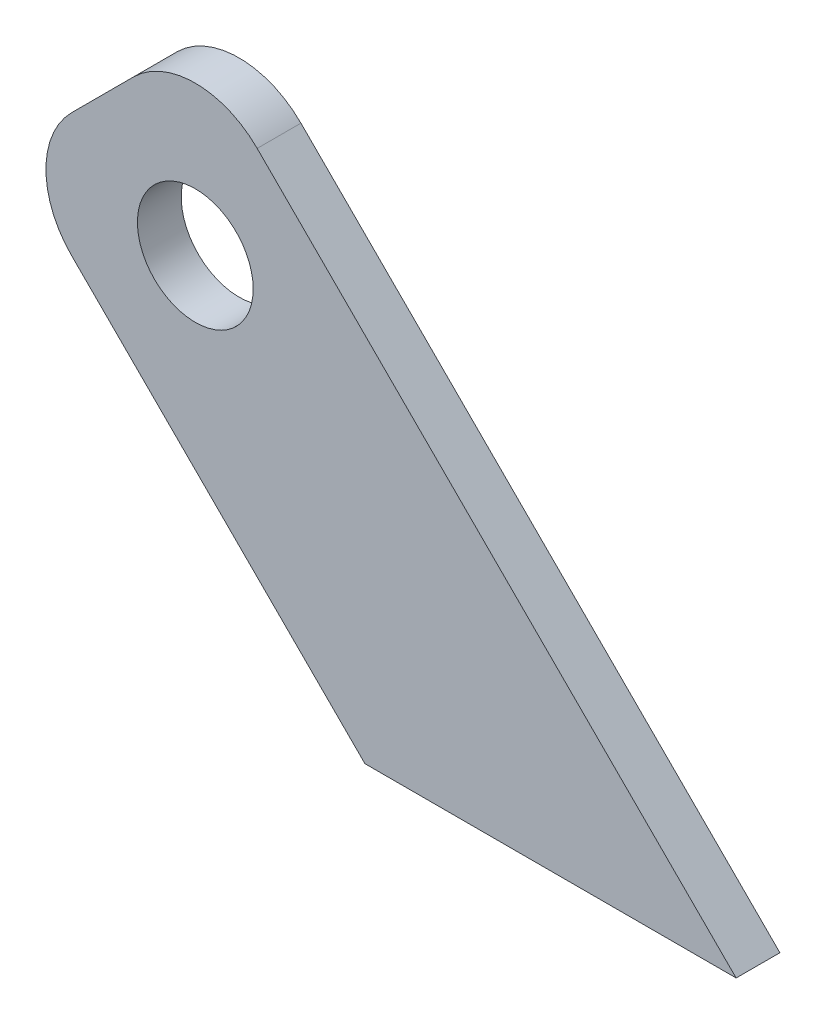
ISO-10303-21;
HEADER;
FILE_DESCRIPTION(('STEP AP214'),'2;1');
FILE_NAME('part.step','',(''),(''),'','','');
FILE_SCHEMA(('AUTOMOTIVE_DESIGN { 1 0 10303 214 1 1 1 1 }'));
ENDSEC;
DATA;
#1=APPLICATION_CONTEXT('core data for automotive mechanical design processes');
#2=APPLICATION_PROTOCOL_DEFINITION('international standard','automotive_design',2000,#1);
#3=PRODUCT_CONTEXT('',#1,'mechanical');
#4=PRODUCT('Part','Part','',(#3));
#5=PRODUCT_RELATED_PRODUCT_CATEGORY('part','',(#4));
#6=PRODUCT_DEFINITION_FORMATION('','',#4);
#7=PRODUCT_DEFINITION_CONTEXT('part definition',#1,'design');
#8=PRODUCT_DEFINITION('design','',#6,#7);
#9=PRODUCT_DEFINITION_SHAPE('','',#8);
#10=(LENGTH_UNIT() NAMED_UNIT(*) SI_UNIT(.MILLI.,.METRE.));
#11=(NAMED_UNIT(*) PLANE_ANGLE_UNIT() SI_UNIT($,.RADIAN.));
#12=(NAMED_UNIT(*) SI_UNIT($,.STERADIAN.) SOLID_ANGLE_UNIT());
#13=UNCERTAINTY_MEASURE_WITH_UNIT(LENGTH_MEASURE(1.E-05),#10,'distance_accuracy_value','');
#14=(GEOMETRIC_REPRESENTATION_CONTEXT(3) GLOBAL_UNCERTAINTY_ASSIGNED_CONTEXT((#13)) GLOBAL_UNIT_ASSIGNED_CONTEXT((#10,
#11,#12)) REPRESENTATION_CONTEXT('',''));
#15=CARTESIAN_POINT('',(0.,0.,0.));
#16=DIRECTION('',(0.,0.,1.));
#17=DIRECTION('',(1.,0.,0.));
#18=AXIS2_PLACEMENT_3D('',#15,#16,#17);
#19=CARTESIAN_POINT('',(33.610044183049,38.0994845362194,3.175));
#20=DIRECTION('',(0.,0.,-1.));
#21=DIRECTION('',(-1.,0.,0.));
#22=AXIS2_PLACEMENT_3D('',#19,#20,#21);
#23=CYLINDRICAL_SURFACE('',#22,6.35);
#24=CARTESIAN_POINT('',(33.610044183049,38.0994845362194,0.));
#25=DIRECTION('',(0.,0.,1.));
#26=DIRECTION('',(1.,0.,0.));
#27=AXIS2_PLACEMENT_3D('',#24,#25,#26);
#28=CIRCLE('',#27,6.35);
#29=CARTESIAN_POINT('',(29.1198730615669,33.6093995370453,0.));
#30=VERTEX_POINT('',#29);
#31=CARTESIAN_POINT('',(29.119959183875,42.5896556577015,0.));
#32=VERTEX_POINT('',#31);
#33=EDGE_CURVE('E144',#30,#32,#28,.F.);
#34=ORIENTED_EDGE('',*,*,#33,.F.);
#35=DIRECTION('',(0.,0.,-1.));
#36=VECTOR('',#35,1.);
#37=CARTESIAN_POINT('',(29.1198730615669,33.6093995370453,3.175));
#38=LINE('',#37,#36);
#39=CARTESIAN_POINT('',(29.1198730615669,33.6093995370453,3.175));
#40=VERTEX_POINT('',#39);
#41=EDGE_CURVE('E11',#40,#30,#38,.T.);
#42=ORIENTED_EDGE('',*,*,#41,.F.);
#43=CARTESIAN_POINT('',(33.610044183049,38.0994845362194,3.175));
#44=DIRECTION('',(0.,0.,1.));
#45=DIRECTION('',(1.,0.,0.));
#46=AXIS2_PLACEMENT_3D('',#43,#44,#45);
#47=CIRCLE('',#46,6.35);
#48=CARTESIAN_POINT('',(29.119959183875,42.5896556577015,3.175));
#49=VERTEX_POINT('',#48);
#50=EDGE_CURVE('E171',#40,#49,#47,.F.);
#51=ORIENTED_EDGE('',*,*,#50,.T.);
#52=DIRECTION('',(0.,0.,-1.));
#53=VECTOR('',#52,1.);
#54=CARTESIAN_POINT('',(29.119959183875,42.5896556577015,3.175));
#55=LINE('',#54,#53);
#56=EDGE_CURVE('E62',#49,#32,#55,.T.);
#57=ORIENTED_EDGE('',*,*,#56,.T.);
#58=EDGE_LOOP('',(#34,#42,#51,#57));
#59=FACE_BOUND('',#58,.T.);
#60=ADVANCED_FACE('F45',(#59),#23,.T.);
#61=CARTESIAN_POINT('',(31.364915561154,31.3643139763043,3.175));
#62=DIRECTION('',(-0.707113562438127,-0.707099999869934,0.));
#63=DIRECTION('',(0.707099999869934,-0.707113562438127,0.));
#64=AXIS2_PLACEMENT_3D('',#61,#62,#63);
#65=PLANE('',#64);
#66=DIRECTION('',(-0.707099999869934,0.707113562438127,0.));
#67=VECTOR('',#66,1.);
#68=CARTESIAN_POINT('',(31.364915561154,31.3643139763043,0.));
#69=LINE('',#68,#67);
#70=CARTESIAN_POINT('',(40.3449994380201,22.384057856474,0.));
#71=VERTEX_POINT('',#70);
#72=EDGE_CURVE('E147',#71,#30,#69,.T.);
#73=ORIENTED_EDGE('',*,*,#72,.F.);
#74=DIRECTION('',(0.,0.,-1.));
#75=VECTOR('',#74,1.);
#76=CARTESIAN_POINT('',(40.3449994380201,22.384057856474,3.175));
#77=LINE('',#76,#75);
#78=CARTESIAN_POINT('',(40.3449994380201,22.384057856474,3.175));
#79=VERTEX_POINT('',#78);
#80=EDGE_CURVE('E54',#79,#71,#77,.T.);
#81=ORIENTED_EDGE('',*,*,#80,.F.);
#82=DIRECTION('',(-0.707099999869934,0.707113562438127,0.));
#83=VECTOR('',#82,1.);
#84=CARTESIAN_POINT('',(31.364915561154,31.3643139763043,3.175));
#85=LINE('',#84,#83);
#86=EDGE_CURVE('E196',#79,#40,#85,.T.);
#87=ORIENTED_EDGE('',*,*,#86,.T.);
#88=ORIENTED_EDGE('',*,*,#41,.T.);
#89=EDGE_LOOP('',(#73,#81,#87,#88));
#90=FACE_BOUND('',#89,.T.);
#91=ADVANCED_FACE('F195',(#90),#65,.T.);
#92=CARTESIAN_POINT('',(31.3641417292227,31.3647433107686,3.175));
#93=DIRECTION('',(0.707099999869934,0.707113562438127,0.));
#94=DIRECTION('',(-0.707113562438127,0.707099999869934,0.));
#95=AXIS2_PLACEMENT_3D('',#92,#93,#94);
#96=PLANE('',#95);
#97=DIRECTION('',(0.707113562438127,-0.707099999869934,0.));
#98=VECTOR('',#97,1.);
#99=CARTESIAN_POINT('',(31.3641417292227,31.3647433107686,0.));
#100=LINE('',#99,#98);
#101=CARTESIAN_POINT('',(50.4102503478579,12.319,0.));
#102=VERTEX_POINT('',#101);
#103=EDGE_CURVE('E151',#71,#102,#100,.T.);
#104=ORIENTED_EDGE('',*,*,#103,.T.);
#105=DIRECTION('',(0.,0.,-1.));
#106=VECTOR('',#105,1.);
#107=CARTESIAN_POINT('',(50.4102503478579,12.319,3.175));
#108=LINE('',#107,#106);
#109=CARTESIAN_POINT('',(50.4102503478579,12.319,3.175));
#110=VERTEX_POINT('',#109);
#111=EDGE_CURVE('E178',#110,#102,#108,.T.);
#112=ORIENTED_EDGE('',*,*,#111,.F.);
#113=DIRECTION('',(0.707113562438127,-0.707099999869934,0.));
#114=VECTOR('',#113,1.);
#115=CARTESIAN_POINT('',(31.3641417292227,31.3647433107686,3.175));
#116=LINE('',#115,#114);
#117=EDGE_CURVE('E134',#79,#110,#116,.T.);
#118=ORIENTED_EDGE('',*,*,#117,.F.);
#119=ORIENTED_EDGE('',*,*,#80,.T.);
#120=EDGE_LOOP('',(#104,#112,#118,#119));
#121=FACE_BOUND('',#120,.T.);
#122=ADVANCED_FACE('F185',(#121),#96,.F.);
#123=CARTESIAN_POINT('',(0.,12.319,3.175));
#124=DIRECTION('',(0.,1.,0.));
#125=DIRECTION('',(0.,0.,1.));
#126=AXIS2_PLACEMENT_3D('',#123,#124,#125);
#127=PLANE('',#126);
#128=DIRECTION('',(1.,0.,0.));
#129=VECTOR('',#128,1.);
#130=CARTESIAN_POINT('',(0.,12.319,0.));
#131=LINE('',#130,#129);
#132=CARTESIAN_POINT('',(77.3512770817062,12.319,0.));
#133=VERTEX_POINT('',#132);
#134=EDGE_CURVE('E154',#102,#133,#131,.T.);
#135=ORIENTED_EDGE('',*,*,#134,.T.);
#136=DIRECTION('',(0.,0.,-1.));
#137=VECTOR('',#136,1.);
#138=CARTESIAN_POINT('',(77.3512770817062,12.319,3.175));
#139=LINE('',#138,#137);
#140=CARTESIAN_POINT('',(77.3512770817062,12.319,3.175));
#141=VERTEX_POINT('',#140);
#142=EDGE_CURVE('E117',#141,#133,#139,.T.);
#143=ORIENTED_EDGE('',*,*,#142,.F.);
#144=DIRECTION('',(1.,0.,0.));
#145=VECTOR('',#144,1.);
#146=CARTESIAN_POINT('',(0.,12.319,3.175));
#147=LINE('',#146,#145);
#148=EDGE_CURVE('E129',#110,#141,#147,.T.);
#149=ORIENTED_EDGE('',*,*,#148,.F.);
#150=ORIENTED_EDGE('',*,*,#111,.T.);
#151=EDGE_LOOP('',(#135,#143,#149,#150));
#152=FACE_BOUND('',#151,.T.);
#153=ADVANCED_FACE('F215',(#152),#127,.F.);
#154=CARTESIAN_POINT('',(44.8343967267449,44.8352566752149,3.175));
#155=DIRECTION('',(0.707099999869934,0.707113562438128,0.));
#156=DIRECTION('',(-0.707113562438128,0.707099999869934,0.));
#157=AXIS2_PLACEMENT_3D('',#154,#155,#156);
#158=PLANE('',#157);
#159=DIRECTION('',(0.707113562438128,-0.707099999869934,0.));
#160=VECTOR('',#159,1.);
#161=CARTESIAN_POINT('',(44.8343967267449,44.8352566752149,0.));
#162=LINE('',#161,#160);
#163=CARTESIAN_POINT('',(42.5900849991741,47.079525356474,0.));
#164=VERTEX_POINT('',#163);
#165=EDGE_CURVE('E113',#164,#133,#162,.T.);
#166=ORIENTED_EDGE('',*,*,#165,.F.);
#167=DIRECTION('',(0.,0.,-1.));
#168=VECTOR('',#167,1.);
#169=CARTESIAN_POINT('',(42.5900849991741,47.079525356474,3.175));
#170=LINE('',#169,#168);
#171=CARTESIAN_POINT('',(42.5900849991741,47.079525356474,3.175));
#172=VERTEX_POINT('',#171);
#173=EDGE_CURVE('E107',#172,#164,#170,.T.);
#174=ORIENTED_EDGE('',*,*,#173,.F.);
#175=DIRECTION('',(0.707113562438128,-0.707099999869934,0.));
#176=VECTOR('',#175,1.);
#177=CARTESIAN_POINT('',(44.8343967267449,44.8352566752149,3.175));
#178=LINE('',#177,#176);
#179=EDGE_CURVE('E111',#172,#141,#178,.T.);
#180=ORIENTED_EDGE('',*,*,#179,.T.);
#181=ORIENTED_EDGE('',*,*,#142,.T.);
#182=EDGE_LOOP('',(#166,#174,#180,#181));
#183=FACE_BOUND('',#182,.T.);
#184=ADVANCED_FACE('F109',(#183),#158,.T.);
#185=CARTESIAN_POINT('',(38.1,42.5893542349919,3.175));
#186=DIRECTION('',(0.,0.,-1.));
#187=DIRECTION('',(-1.,0.,0.));
#188=AXIS2_PLACEMENT_3D('',#185,#186,#187);
#189=CYLINDRICAL_SURFACE('',#188,6.35);
#190=CARTESIAN_POINT('',(38.1,42.5893542349919,0.));
#191=DIRECTION('',(0.,0.,1.));
#192=DIRECTION('',(1.,0.,0.));
#193=AXIS2_PLACEMENT_3D('',#190,#191,#192);
#194=CIRCLE('',#193,6.35);
#195=CARTESIAN_POINT('',(33.6099150008259,47.079525356474,0.));
#196=VERTEX_POINT('',#195);
#197=EDGE_CURVE('E160',#164,#196,#194,.T.);
#198=ORIENTED_EDGE('',*,*,#197,.T.);
#199=DIRECTION('',(0.,0.,-1.));
#200=VECTOR('',#199,1.);
#201=CARTESIAN_POINT('',(33.6099150008259,47.079525356474,3.175));
#202=LINE('',#201,#200);
#203=CARTESIAN_POINT('',(33.6099150008259,47.079525356474,3.175));
#204=VERTEX_POINT('',#203);
#205=EDGE_CURVE('E85',#204,#196,#202,.T.);
#206=ORIENTED_EDGE('',*,*,#205,.F.);
#207=CARTESIAN_POINT('',(38.1,42.5893542349919,3.175));
#208=DIRECTION('',(0.,0.,1.));
#209=DIRECTION('',(1.,0.,0.));
#210=AXIS2_PLACEMENT_3D('',#207,#208,#209);
#211=CIRCLE('',#210,6.35);
#212=EDGE_CURVE('E119',#172,#204,#211,.T.);
#213=ORIENTED_EDGE('',*,*,#212,.F.);
#214=ORIENTED_EDGE('',*,*,#173,.T.);
#215=EDGE_LOOP('',(#198,#206,#213,#214));
#216=FACE_BOUND('',#215,.T.);
#217=ADVANCED_FACE('F120',(#216),#189,.T.);
#218=CARTESIAN_POINT('',(-6.73512749876113,6.73525668222317,3.175));
#219=DIRECTION('',(-0.707099999869934,0.707113562438127,0.));
#220=DIRECTION('',(-0.707113562438127,-0.707099999869934,0.));
#221=AXIS2_PLACEMENT_3D('',#218,#219,#220);
#222=PLANE('',#221);
#223=DIRECTION('',(0.707113562438127,0.707099999869934,0.));
#224=VECTOR('',#223,1.);
#225=CARTESIAN_POINT('',(-6.73512749876113,6.73525668222317,0.));
#226=LINE('',#225,#224);
#227=EDGE_CURVE('E163',#32,#196,#226,.T.);
#228=ORIENTED_EDGE('',*,*,#227,.F.);
#229=ORIENTED_EDGE('',*,*,#56,.F.);
#230=DIRECTION('',(0.707113562438127,0.707099999869934,0.));
#231=VECTOR('',#230,1.);
#232=CARTESIAN_POINT('',(-6.73512749876113,6.73525668222317,3.175));
#233=LINE('',#232,#231);
#234=EDGE_CURVE('E124',#49,#204,#233,.T.);
#235=ORIENTED_EDGE('',*,*,#234,.T.);
#236=ORIENTED_EDGE('',*,*,#205,.T.);
#237=EDGE_LOOP('',(#228,#229,#235,#236));
#238=FACE_BOUND('',#237,.T.);
#239=ADVANCED_FACE('F197',(#238),#222,.T.);
#240=CARTESIAN_POINT('',(38.1,38.0992692349919,3.175));
#241=DIRECTION('',(0.,0.,-1.));
#242=DIRECTION('',(-1.,0.,0.));
#243=AXIS2_PLACEMENT_3D('',#240,#241,#242);
#244=CYLINDRICAL_SURFACE('',#243,4.19988999999999);
#245=CARTESIAN_POINT('',(38.1,38.0992692349919,3.175));
#246=DIRECTION('',(0.,0.,1.));
#247=DIRECTION('',(1.,0.,0.));
#248=AXIS2_PLACEMENT_3D('',#245,#246,#247);
#249=CIRCLE('',#248,4.19988999999999);
#250=CARTESIAN_POINT('',(42.29989,38.0992692349919,3.175));
#251=VERTEX_POINT('',#250);
#252=EDGE_CURVE('E140',#251,#251,#249,.T.);
#253=ORIENTED_EDGE('',*,*,#252,.T.);
#254=EDGE_LOOP('',(#253));
#255=FACE_BOUND('',#254,.T.);
#256=CARTESIAN_POINT('',(38.1,38.0992692349919,0.));
#257=DIRECTION('',(0.,0.,1.));
#258=DIRECTION('',(1.,0.,0.));
#259=AXIS2_PLACEMENT_3D('',#256,#257,#258);
#260=CIRCLE('',#259,4.19988999999999);
#261=CARTESIAN_POINT('',(42.29989,38.0992692349919,0.));
#262=VERTEX_POINT('',#261);
#263=EDGE_CURVE('E167',#262,#262,#260,.T.);
#264=ORIENTED_EDGE('',*,*,#263,.F.);
#265=EDGE_LOOP('',(#264));
#266=FACE_BOUND('',#265,.T.);
#267=ADVANCED_FACE('F199',(#255,#266),#244,.F.);
#268=CARTESIAN_POINT('',(0.,0.,3.175));
#269=DIRECTION('',(0.,0.,1.));
#270=DIRECTION('',(1.,0.,0.));
#271=AXIS2_PLACEMENT_3D('',#268,#269,#270);
#272=PLANE('',#271);
#273=ORIENTED_EDGE('',*,*,#50,.F.);
#274=ORIENTED_EDGE('',*,*,#86,.F.);
#275=ORIENTED_EDGE('',*,*,#117,.T.);
#276=ORIENTED_EDGE('',*,*,#148,.T.);
#277=ORIENTED_EDGE('',*,*,#179,.F.);
#278=ORIENTED_EDGE('',*,*,#212,.T.);
#279=ORIENTED_EDGE('',*,*,#234,.F.);
#280=EDGE_LOOP('',(#273,#274,#275,#276,#277,#278,#279));
#281=FACE_BOUND('',#280,.T.);
#282=ORIENTED_EDGE('',*,*,#252,.F.);
#283=EDGE_LOOP('',(#282));
#284=FACE_BOUND('',#283,.T.);
#285=ADVANCED_FACE('F126',(#281,#284),#272,.T.);
#286=CARTESIAN_POINT('',(0.,0.,0.));
#287=DIRECTION('',(0.,0.,1.));
#288=DIRECTION('',(1.,0.,0.));
#289=AXIS2_PLACEMENT_3D('',#286,#287,#288);
#290=PLANE('',#289);
#291=ORIENTED_EDGE('',*,*,#33,.T.);
#292=ORIENTED_EDGE('',*,*,#227,.T.);
#293=ORIENTED_EDGE('',*,*,#197,.F.);
#294=ORIENTED_EDGE('',*,*,#165,.T.);
#295=ORIENTED_EDGE('',*,*,#134,.F.);
#296=ORIENTED_EDGE('',*,*,#103,.F.);
#297=ORIENTED_EDGE('',*,*,#72,.T.);
#298=EDGE_LOOP('',(#291,#292,#293,#294,#295,#296,#297));
#299=FACE_BOUND('',#298,.T.);
#300=ORIENTED_EDGE('',*,*,#263,.T.);
#301=EDGE_LOOP('',(#300));
#302=FACE_BOUND('',#301,.T.);
#303=ADVANCED_FACE('F193',(#299,#302),#290,.F.);
#304=CLOSED_SHELL('',(#60,#91,#122,#153,#184,#217,#239,#267,#285,#303));
#305=MANIFOLD_SOLID_BREP('B2',#304);
#306=ADVANCED_BREP_SHAPE_REPRESENTATION('',(#18,#305),#14);
#307=SHAPE_DEFINITION_REPRESENTATION(#9,#306);
ENDSEC;
END-ISO-10303-21;
